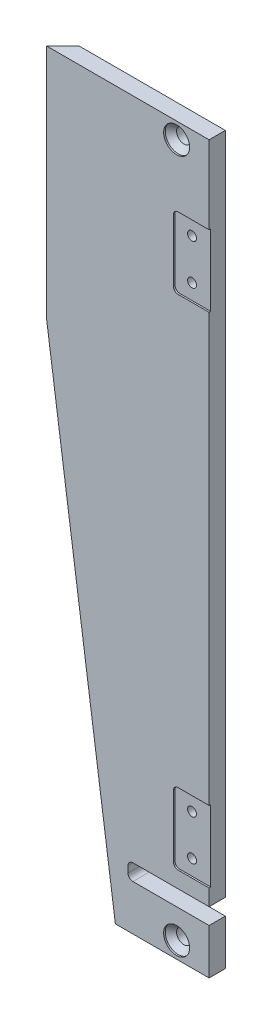
ISO-10303-21;
HEADER;
FILE_DESCRIPTION(('STEP AP214'),'2;1');
FILE_NAME('part.step','',(''),(''),'','','');
FILE_SCHEMA(('AUTOMOTIVE_DESIGN { 1 0 10303 214 1 1 1 1 }'));
ENDSEC;
DATA;
#1=APPLICATION_CONTEXT('core data for automotive mechanical design processes');
#2=APPLICATION_PROTOCOL_DEFINITION('international standard','automotive_design',2000,#1);
#3=PRODUCT_CONTEXT('',#1,'mechanical');
#4=PRODUCT('Part','Part','',(#3));
#5=PRODUCT_RELATED_PRODUCT_CATEGORY('part','',(#4));
#6=PRODUCT_DEFINITION_FORMATION('','',#4);
#7=PRODUCT_DEFINITION_CONTEXT('part definition',#1,'design');
#8=PRODUCT_DEFINITION('design','',#6,#7);
#9=PRODUCT_DEFINITION_SHAPE('','',#8);
#10=(LENGTH_UNIT() NAMED_UNIT(*) SI_UNIT(.MILLI.,.METRE.));
#11=(NAMED_UNIT(*) PLANE_ANGLE_UNIT() SI_UNIT($,.RADIAN.));
#12=(NAMED_UNIT(*) SI_UNIT($,.STERADIAN.) SOLID_ANGLE_UNIT());
#13=UNCERTAINTY_MEASURE_WITH_UNIT(LENGTH_MEASURE(1.E-05),#10,'distance_accuracy_value','');
#14=(GEOMETRIC_REPRESENTATION_CONTEXT(3) GLOBAL_UNCERTAINTY_ASSIGNED_CONTEXT((#13)) GLOBAL_UNIT_ASSIGNED_CONTEXT((#10,
#11,#12)) REPRESENTATION_CONTEXT('',''));
#15=CARTESIAN_POINT('',(0.,0.,0.));
#16=DIRECTION('',(0.,0.,1.));
#17=DIRECTION('',(1.,0.,0.));
#18=AXIS2_PLACEMENT_3D('',#15,#16,#17);
#19=CARTESIAN_POINT('',(0.,-447.,10.));
#20=DIRECTION('',(-1.,0.,0.));
#21=DIRECTION('',(0.,0.,1.));
#22=AXIS2_PLACEMENT_3D('',#19,#20,#21);
#23=PLANE('',#22);
#24=DIRECTION('',(0.,1.,0.));
#25=VECTOR('',#24,1.);
#26=CARTESIAN_POINT('',(0.,-447.,0.));
#27=LINE('',#26,#25);
#28=CARTESIAN_POINT('',(0.,-447.,0.));
#29=VERTEX_POINT('',#28);
#30=CARTESIAN_POINT('',(0.,-419.,0.));
#31=VERTEX_POINT('',#30);
#32=EDGE_CURVE('E331',#29,#31,#27,.T.);
#33=ORIENTED_EDGE('',*,*,#32,.T.);
#34=DIRECTION('',(0.,0.,1.));
#35=VECTOR('',#34,1.);
#36=CARTESIAN_POINT('',(0.,-419.,-20.));
#37=LINE('',#36,#35);
#38=CARTESIAN_POINT('',(0.,-419.,10.));
#39=VERTEX_POINT('',#38);
#40=EDGE_CURVE('E279',#31,#39,#37,.T.);
#41=ORIENTED_EDGE('',*,*,#40,.T.);
#42=DIRECTION('',(0.,1.,0.));
#43=VECTOR('',#42,1.);
#44=CARTESIAN_POINT('',(0.,-447.,10.));
#45=LINE('',#44,#43);
#46=CARTESIAN_POINT('',(0.,-447.,10.));
#47=VERTEX_POINT('',#46);
#48=EDGE_CURVE('E316',#47,#39,#45,.T.);
#49=ORIENTED_EDGE('',*,*,#48,.F.);
#50=DIRECTION('',(0.,0.,-1.));
#51=VECTOR('',#50,1.);
#52=CARTESIAN_POINT('',(0.,-447.,10.));
#53=LINE('',#52,#51);
#54=EDGE_CURVE('E330',#47,#29,#53,.T.);
#55=ORIENTED_EDGE('',*,*,#54,.T.);
#56=EDGE_LOOP('',(#33,#41,#49,#55));
#57=FACE_BOUND('',#56,.T.);
#58=ADVANCED_FACE('F32',(#57),#23,.F.);
#59=DIRECTION('',(0.,1.,0.));
#60=VECTOR('',#59,1.);
#61=CARTESIAN_POINT('',(0.,-48.0000000000009,9.));
#62=LINE('',#61,#60);
#63=CARTESIAN_POINT('',(0.,-92.0000000000009,9.));
#64=VERTEX_POINT('',#63);
#65=CARTESIAN_POINT('',(0.,-48.0000000000009,9.));
#66=VERTEX_POINT('',#65);
#67=EDGE_CURVE('E195',#64,#66,#62,.T.);
#68=ORIENTED_EDGE('',*,*,#67,.F.);
#69=DIRECTION('',(0.,0.,1.));
#70=VECTOR('',#69,1.);
#71=CARTESIAN_POINT('',(0.,-92.0000000000009,9.));
#72=LINE('',#71,#70);
#73=CARTESIAN_POINT('',(0.,-92.0000000000009,10.));
#74=VERTEX_POINT('',#73);
#75=EDGE_CURVE('E267',#64,#74,#72,.T.);
#76=ORIENTED_EDGE('',*,*,#75,.T.);
#77=CARTESIAN_POINT('',(0.,-355.000000000001,10.));
#78=VERTEX_POINT('',#77);
#79=EDGE_CURVE('E414',#78,#74,#45,.T.);
#80=ORIENTED_EDGE('',*,*,#79,.F.);
#81=DIRECTION('',(0.,0.,1.));
#82=VECTOR('',#81,1.);
#83=CARTESIAN_POINT('',(0.,-355.000000000001,9.));
#84=LINE('',#83,#82);
#85=CARTESIAN_POINT('',(0.,-355.000000000001,9.));
#86=VERTEX_POINT('',#85);
#87=EDGE_CURVE('E55',#86,#78,#84,.T.);
#88=ORIENTED_EDGE('',*,*,#87,.F.);
#89=DIRECTION('',(0.,1.,0.));
#90=VECTOR('',#89,1.);
#91=CARTESIAN_POINT('',(0.,-355.000000000001,9.));
#92=LINE('',#91,#90);
#93=CARTESIAN_POINT('',(0.,-399.000000000001,9.));
#94=VERTEX_POINT('',#93);
#95=EDGE_CURVE('E218',#94,#86,#92,.T.);
#96=ORIENTED_EDGE('',*,*,#95,.F.);
#97=DIRECTION('',(0.,0.,1.));
#98=VECTOR('',#97,1.);
#99=CARTESIAN_POINT('',(0.,-399.000000000001,9.));
#100=LINE('',#99,#98);
#101=CARTESIAN_POINT('',(0.,-399.000000000001,10.));
#102=VERTEX_POINT('',#101);
#103=EDGE_CURVE('E250',#94,#102,#100,.T.);
#104=ORIENTED_EDGE('',*,*,#103,.T.);
#105=CARTESIAN_POINT('',(0.,-409.,10.));
#106=VERTEX_POINT('',#105);
#107=EDGE_CURVE('E320',#106,#102,#45,.T.);
#108=ORIENTED_EDGE('',*,*,#107,.F.);
#109=DIRECTION('',(0.,0.,1.));
#110=VECTOR('',#109,1.);
#111=CARTESIAN_POINT('',(0.,-409.,-20.));
#112=LINE('',#111,#110);
#113=CARTESIAN_POINT('',(0.,-409.,0.));
#114=VERTEX_POINT('',#113);
#115=EDGE_CURVE('E278',#114,#106,#112,.T.);
#116=ORIENTED_EDGE('',*,*,#115,.F.);
#117=CARTESIAN_POINT('',(0.,0.,0.));
#118=VERTEX_POINT('',#117);
#119=EDGE_CURVE('E335',#114,#118,#27,.T.);
#120=ORIENTED_EDGE('',*,*,#119,.T.);
#121=DIRECTION('',(0.,0.,-1.));
#122=VECTOR('',#121,1.);
#123=CARTESIAN_POINT('',(0.,0.,10.));
#124=LINE('',#123,#122);
#125=CARTESIAN_POINT('',(0.,0.,10.));
#126=VERTEX_POINT('',#125);
#127=EDGE_CURVE('E342',#126,#118,#124,.T.);
#128=ORIENTED_EDGE('',*,*,#127,.F.);
#129=CARTESIAN_POINT('',(0.,-48.0000000000009,10.));
#130=VERTEX_POINT('',#129);
#131=EDGE_CURVE('E210',#130,#126,#45,.T.);
#132=ORIENTED_EDGE('',*,*,#131,.F.);
#133=DIRECTION('',(0.,0.,1.));
#134=VECTOR('',#133,1.);
#135=CARTESIAN_POINT('',(0.,-48.0000000000009,9.));
#136=LINE('',#135,#134);
#137=EDGE_CURVE('E47',#66,#130,#136,.T.);
#138=ORIENTED_EDGE('',*,*,#137,.F.);
#139=EDGE_LOOP('',(#68,#76,#80,#88,#96,#104,#108,#116,#120,#128,#132,#138));
#140=FACE_BOUND('',#139,.T.);
#141=ADVANCED_FACE('F208',(#140),#23,.F.);
#142=CARTESIAN_POINT('',(0.,0.,10.));
#143=DIRECTION('',(0.,-1.,0.));
#144=DIRECTION('',(0.,0.,-1.));
#145=AXIS2_PLACEMENT_3D('',#142,#143,#144);
#146=PLANE('',#145);
#147=DIRECTION('',(-1.,0.,0.));
#148=VECTOR('',#147,1.);
#149=CARTESIAN_POINT('',(0.,0.,0.));
#150=LINE('',#149,#148);
#151=CARTESIAN_POINT('',(-89.9999999999999,0.,0.));
#152=VERTEX_POINT('',#151);
#153=EDGE_CURVE('E334',#118,#152,#150,.T.);
#154=ORIENTED_EDGE('',*,*,#153,.T.);
#155=DIRECTION('',(0.707106781186549,0.,-0.707106781186546));
#156=VECTOR('',#155,1.);
#157=CARTESIAN_POINT('',(-100.,0.,10.));
#158=LINE('',#157,#156);
#159=CARTESIAN_POINT('',(-100.,0.,10.));
#160=VERTEX_POINT('',#159);
#161=EDGE_CURVE('E351',#152,#160,#158,.F.);
#162=ORIENTED_EDGE('',*,*,#161,.T.);
#163=DIRECTION('',(-1.,0.,0.));
#164=VECTOR('',#163,1.);
#165=CARTESIAN_POINT('',(0.,0.,10.));
#166=LINE('',#165,#164);
#167=EDGE_CURVE('E319',#126,#160,#166,.T.);
#168=ORIENTED_EDGE('',*,*,#167,.F.);
#169=ORIENTED_EDGE('',*,*,#127,.T.);
#170=EDGE_LOOP('',(#154,#162,#168,#169));
#171=FACE_BOUND('',#170,.T.);
#172=ADVANCED_FACE('F401',(#171),#146,.F.);
#173=CARTESIAN_POINT('',(-57.69720875458,-447.,10.));
#174=DIRECTION('',(0.,1.,0.));
#175=DIRECTION('',(-1.,0.,0.));
#176=AXIS2_PLACEMENT_3D('',#173,#174,#175);
#177=PLANE('',#176);
#178=DIRECTION('',(1.,0.,0.));
#179=VECTOR('',#178,1.);
#180=CARTESIAN_POINT('',(-57.69720875458,-447.,10.));
#181=LINE('',#180,#179);
#182=CARTESIAN_POINT('',(-57.69720875458,-447.,10.));
#183=VERTEX_POINT('',#182);
#184=EDGE_CURVE('E328',#183,#47,#181,.T.);
#185=ORIENTED_EDGE('',*,*,#184,.F.);
#186=DIRECTION('',(-0.710555868400576,0.,0.703640787534025));
#187=VECTOR('',#186,1.);
#188=CARTESIAN_POINT('',(-79.0554498870937,-447.,31.1503841980111));
#189=LINE('',#188,#187);
#190=CARTESIAN_POINT('',(-47.5989330293938,-447.,0.));
#191=VERTEX_POINT('',#190);
#192=EDGE_CURVE('E345',#183,#191,#189,.F.);
#193=ORIENTED_EDGE('',*,*,#192,.T.);
#194=DIRECTION('',(1.,0.,0.));
#195=VECTOR('',#194,1.);
#196=CARTESIAN_POINT('',(-57.69720875458,-447.,0.));
#197=LINE('',#196,#195);
#198=EDGE_CURVE('E338',#191,#29,#197,.T.);
#199=ORIENTED_EDGE('',*,*,#198,.T.);
#200=ORIENTED_EDGE('',*,*,#54,.F.);
#201=EDGE_LOOP('',(#185,#193,#199,#200));
#202=FACE_BOUND('',#201,.T.);
#203=ADVANCED_FACE('F519',(#202),#177,.F.);
#204=CARTESIAN_POINT('',(0.,0.,10.));
#205=DIRECTION('',(0.,0.,1.));
#206=DIRECTION('',(1.,0.,0.));
#207=AXIS2_PLACEMENT_3D('',#204,#205,#206);
#208=PLANE('',#207);
#209=DIRECTION('',(1.,0.,0.));
#210=VECTOR('',#209,1.);
#211=CARTESIAN_POINT('',(-18.9999999999995,-92.0000000000009,10.));
#212=LINE('',#211,#210);
#213=CARTESIAN_POINT('',(-18.9999999999995,-92.0000000000009,10.));
#214=VERTEX_POINT('',#213);
#215=EDGE_CURVE('E205',#214,#74,#212,.T.);
#216=ORIENTED_EDGE('',*,*,#215,.F.);
#217=CARTESIAN_POINT('',(-18.9999999999995,-89.0000000000009,10.));
#218=DIRECTION('',(0.,0.,1.));
#219=DIRECTION('',(1.,0.,0.));
#220=AXIS2_PLACEMENT_3D('',#217,#218,#219);
#221=CIRCLE('',#220,3.);
#222=CARTESIAN_POINT('',(-21.9999999999995,-89.0000000000009,10.));
#223=VERTEX_POINT('',#222);
#224=EDGE_CURVE('E428',#223,#214,#221,.T.);
#225=ORIENTED_EDGE('',*,*,#224,.F.);
#226=DIRECTION('',(0.,-1.,0.));
#227=VECTOR('',#226,1.);
#228=CARTESIAN_POINT('',(-21.9999999999995,-51.0000000000009,10.));
#229=LINE('',#228,#227);
#230=CARTESIAN_POINT('',(-21.9999999999995,-51.0000000000009,10.));
#231=VERTEX_POINT('',#230);
#232=EDGE_CURVE('E422',#231,#223,#229,.T.);
#233=ORIENTED_EDGE('',*,*,#232,.F.);
#234=CARTESIAN_POINT('',(-18.9999999999995,-51.0000000000009,10.));
#235=DIRECTION('',(0.,0.,1.));
#236=DIRECTION('',(1.,0.,0.));
#237=AXIS2_PLACEMENT_3D('',#234,#235,#236);
#238=CIRCLE('',#237,3.);
#239=CARTESIAN_POINT('',(-18.9999999999995,-48.0000000000009,10.));
#240=VERTEX_POINT('',#239);
#241=EDGE_CURVE('E420',#240,#231,#238,.T.);
#242=ORIENTED_EDGE('',*,*,#241,.F.);
#243=DIRECTION('',(-1.,0.,0.));
#244=VECTOR('',#243,1.);
#245=CARTESIAN_POINT('',(-18.9999999999995,-48.0000000000009,10.));
#246=LINE('',#245,#244);
#247=EDGE_CURVE('E253',#130,#240,#246,.T.);
#248=ORIENTED_EDGE('',*,*,#247,.F.);
#249=ORIENTED_EDGE('',*,*,#131,.T.);
#250=ORIENTED_EDGE('',*,*,#167,.T.);
#251=DIRECTION('',(0.,-1.,0.));
#252=VECTOR('',#251,1.);
#253=CARTESIAN_POINT('',(-100.,0.,10.));
#254=LINE('',#253,#252);
#255=CARTESIAN_POINT('',(-100.,-146.,10.));
#256=VERTEX_POINT('',#255);
#257=EDGE_CURVE('E323',#160,#256,#254,.T.);
#258=ORIENTED_EDGE('',*,*,#257,.T.);
#259=DIRECTION('',(0.139173100960066,-0.99026806874157,0.));
#260=VECTOR('',#259,1.);
#261=CARTESIAN_POINT('',(-100.,-146.,10.));
#262=LINE('',#261,#260);
#263=EDGE_CURVE('E325',#256,#183,#262,.T.);
#264=ORIENTED_EDGE('',*,*,#263,.T.);
#265=ORIENTED_EDGE('',*,*,#184,.T.);
#266=ORIENTED_EDGE('',*,*,#48,.T.);
#267=DIRECTION('',(1.,0.,0.));
#268=VECTOR('',#267,1.);
#269=CARTESIAN_POINT('',(0.,-419.,10.));
#270=LINE('',#269,#268);
#271=CARTESIAN_POINT('',(-46.8972087545804,-419.,10.));
#272=VERTEX_POINT('',#271);
#273=EDGE_CURVE('E276',#272,#39,#270,.T.);
#274=ORIENTED_EDGE('',*,*,#273,.F.);
#275=CARTESIAN_POINT('',(-46.8972087545804,-416.,10.));
#276=DIRECTION('',(0.,0.,1.));
#277=DIRECTION('',(-1.,0.,0.));
#278=AXIS2_PLACEMENT_3D('',#275,#276,#277);
#279=CIRCLE('',#278,3.);
#280=CARTESIAN_POINT('',(-49.8972087545804,-416.,10.));
#281=VERTEX_POINT('',#280);
#282=EDGE_CURVE('E273',#281,#272,#279,.T.);
#283=ORIENTED_EDGE('',*,*,#282,.F.);
#284=DIRECTION('',(0.,-1.,0.));
#285=VECTOR('',#284,1.);
#286=CARTESIAN_POINT('',(-49.8972087545804,-412.,10.));
#287=LINE('',#286,#285);
#288=CARTESIAN_POINT('',(-49.8972087545804,-412.,10.));
#289=VERTEX_POINT('',#288);
#290=EDGE_CURVE('E270',#289,#281,#287,.T.);
#291=ORIENTED_EDGE('',*,*,#290,.F.);
#292=CARTESIAN_POINT('',(-46.8972087545804,-412.,10.));
#293=DIRECTION('',(0.,0.,1.));
#294=DIRECTION('',(1.,0.,0.));
#295=AXIS2_PLACEMENT_3D('',#292,#293,#294);
#296=CIRCLE('',#295,3.);
#297=CARTESIAN_POINT('',(-46.8972087545804,-409.,10.));
#298=VERTEX_POINT('',#297);
#299=EDGE_CURVE('E266',#298,#289,#296,.T.);
#300=ORIENTED_EDGE('',*,*,#299,.F.);
#301=DIRECTION('',(-1.,0.,0.));
#302=VECTOR('',#301,1.);
#303=CARTESIAN_POINT('',(0.,-409.,10.));
#304=LINE('',#303,#302);
#305=EDGE_CURVE('E263',#106,#298,#304,.T.);
#306=ORIENTED_EDGE('',*,*,#305,.F.);
#307=ORIENTED_EDGE('',*,*,#107,.T.);
#308=DIRECTION('',(1.,0.,0.));
#309=VECTOR('',#308,1.);
#310=CARTESIAN_POINT('',(-18.999999999999,-399.000000000001,10.));
#311=LINE('',#310,#309);
#312=CARTESIAN_POINT('',(-18.999999999999,-399.000000000001,10.));
#313=VERTEX_POINT('',#312);
#314=EDGE_CURVE('E222',#313,#102,#311,.T.);
#315=ORIENTED_EDGE('',*,*,#314,.F.);
#316=CARTESIAN_POINT('',(-18.999999999999,-396.000000000001,10.));
#317=DIRECTION('',(0.,0.,1.));
#318=DIRECTION('',(1.,0.,0.));
#319=AXIS2_PLACEMENT_3D('',#316,#317,#318);
#320=CIRCLE('',#319,3.);
#321=CARTESIAN_POINT('',(-21.999999999999,-396.000000000001,10.));
#322=VERTEX_POINT('',#321);
#323=EDGE_CURVE('E246',#322,#313,#320,.T.);
#324=ORIENTED_EDGE('',*,*,#323,.F.);
#325=DIRECTION('',(0.,-1.,0.));
#326=VECTOR('',#325,1.);
#327=CARTESIAN_POINT('',(-21.9999999999995,-358.000000000001,10.));
#328=LINE('',#327,#326);
#329=CARTESIAN_POINT('',(-21.9999999999995,-358.000000000001,10.));
#330=VERTEX_POINT('',#329);
#331=EDGE_CURVE('E243',#330,#322,#328,.T.);
#332=ORIENTED_EDGE('',*,*,#331,.F.);
#333=CARTESIAN_POINT('',(-18.9999999999995,-358.000000000001,10.));
#334=DIRECTION('',(0.,0.,1.));
#335=DIRECTION('',(1.,0.,0.));
#336=AXIS2_PLACEMENT_3D('',#333,#334,#335);
#337=CIRCLE('',#336,3.);
#338=CARTESIAN_POINT('',(-18.9999999999995,-355.000000000001,10.));
#339=VERTEX_POINT('',#338);
#340=EDGE_CURVE('E239',#339,#330,#337,.T.);
#341=ORIENTED_EDGE('',*,*,#340,.F.);
#342=DIRECTION('',(-1.,0.,0.));
#343=VECTOR('',#342,1.);
#344=CARTESIAN_POINT('',(-18.9999999999995,-355.000000000001,10.));
#345=LINE('',#344,#343);
#346=EDGE_CURVE('E237',#78,#339,#345,.T.);
#347=ORIENTED_EDGE('',*,*,#346,.F.);
#348=ORIENTED_EDGE('',*,*,#79,.T.);
#349=EDGE_LOOP('',(#216,#225,#233,#242,#248,#249,#250,#258,#264,#265,#266,#274,#283,#291,#300,
#306,#307,#315,#324,#332,#341,#347,#348));
#350=FACE_BOUND('',#349,.T.);
#351=CARTESIAN_POINT('',(-20.0000000000004,-10.,10.));
#352=DIRECTION('',(0.,0.,1.));
#353=DIRECTION('',(1.,0.,0.));
#354=AXIS2_PLACEMENT_3D('',#351,#352,#353);
#355=CIRCLE('',#354,8.);
#356=CARTESIAN_POINT('',(-12.0000000000004,-10.,10.));
#357=VERTEX_POINT('',#356);
#358=EDGE_CURVE('E282',#357,#357,#355,.T.);
#359=ORIENTED_EDGE('',*,*,#358,.F.);
#360=EDGE_LOOP('',(#359));
#361=FACE_BOUND('',#360,.T.);
#362=CARTESIAN_POINT('',(-19.9999999999972,-437.,10.));
#363=DIRECTION('',(0.,0.,1.));
#364=DIRECTION('',(1.,0.,0.));
#365=AXIS2_PLACEMENT_3D('',#362,#363,#364);
#366=CIRCLE('',#365,8.);
#367=CARTESIAN_POINT('',(-11.9999999999972,-437.,10.));
#368=VERTEX_POINT('',#367);
#369=EDGE_CURVE('E303',#368,#368,#366,.T.);
#370=ORIENTED_EDGE('',*,*,#369,.F.);
#371=EDGE_LOOP('',(#370));
#372=FACE_BOUND('',#371,.T.);
#373=ADVANCED_FACE('F380',(#350,#361,#372),#208,.T.);
#374=CARTESIAN_POINT('',(0.,0.,0.));
#375=DIRECTION('',(0.,0.,1.));
#376=DIRECTION('',(1.,0.,0.));
#377=AXIS2_PLACEMENT_3D('',#374,#375,#376);
#378=PLANE('',#377);
#379=CARTESIAN_POINT('',(-11.4999999999995,-57.5000000000009,0.));
#380=DIRECTION('',(0.,0.,1.));
#381=DIRECTION('',(1.,0.,0.));
#382=AXIS2_PLACEMENT_3D('',#379,#380,#381);
#383=CIRCLE('',#382,2.75);
#384=CARTESIAN_POINT('',(-8.74999999999954,-57.5000000000009,0.));
#385=VERTEX_POINT('',#384);
#386=EDGE_CURVE('E240',#385,#385,#383,.T.);
#387=ORIENTED_EDGE('',*,*,#386,.T.);
#388=EDGE_LOOP('',(#387));
#389=FACE_BOUND('',#388,.T.);
#390=CARTESIAN_POINT('',(-11.4999999999995,-82.5000000000009,0.));
#391=DIRECTION('',(0.,0.,1.));
#392=DIRECTION('',(1.,0.,0.));
#393=AXIS2_PLACEMENT_3D('',#390,#391,#392);
#394=CIRCLE('',#393,2.75);
#395=CARTESIAN_POINT('',(-8.74999999999954,-82.5000000000009,0.));
#396=VERTEX_POINT('',#395);
#397=EDGE_CURVE('E465',#396,#396,#394,.T.);
#398=ORIENTED_EDGE('',*,*,#397,.T.);
#399=EDGE_LOOP('',(#398));
#400=FACE_BOUND('',#399,.T.);
#401=CARTESIAN_POINT('',(-11.499999999999,-364.500000000001,0.));
#402=DIRECTION('',(0.,0.,1.));
#403=DIRECTION('',(1.,0.,0.));
#404=AXIS2_PLACEMENT_3D('',#401,#402,#403);
#405=CIRCLE('',#404,2.75);
#406=CARTESIAN_POINT('',(-8.74999999999895,-364.500000000001,0.));
#407=VERTEX_POINT('',#406);
#408=EDGE_CURVE('E459',#407,#407,#405,.T.);
#409=ORIENTED_EDGE('',*,*,#408,.T.);
#410=EDGE_LOOP('',(#409));
#411=FACE_BOUND('',#410,.T.);
#412=CARTESIAN_POINT('',(-11.499999999999,-389.500000000001,0.));
#413=DIRECTION('',(0.,0.,1.));
#414=DIRECTION('',(1.,0.,0.));
#415=AXIS2_PLACEMENT_3D('',#412,#413,#414);
#416=CIRCLE('',#415,2.75);
#417=CARTESIAN_POINT('',(-8.74999999999895,-389.500000000001,0.));
#418=VERTEX_POINT('',#417);
#419=EDGE_CURVE('E453',#418,#418,#416,.T.);
#420=ORIENTED_EDGE('',*,*,#419,.T.);
#421=EDGE_LOOP('',(#420));
#422=FACE_BOUND('',#421,.T.);
#423=CARTESIAN_POINT('',(-20.0000000000004,-10.,0.));
#424=DIRECTION('',(0.,0.,1.));
#425=DIRECTION('',(1.,0.,0.));
#426=AXIS2_PLACEMENT_3D('',#423,#424,#425);
#427=CIRCLE('',#426,4.50000000000001);
#428=CARTESIAN_POINT('',(-15.5000000000004,-10.,0.));
#429=VERTEX_POINT('',#428);
#430=EDGE_CURVE('E300',#429,#429,#427,.T.);
#431=ORIENTED_EDGE('',*,*,#430,.T.);
#432=EDGE_LOOP('',(#431));
#433=FACE_BOUND('',#432,.T.);
#434=CARTESIAN_POINT('',(-19.9999999999972,-437.,0.));
#435=DIRECTION('',(0.,0.,1.));
#436=DIRECTION('',(1.,0.,0.));
#437=AXIS2_PLACEMENT_3D('',#434,#435,#436);
#438=CIRCLE('',#437,4.50000000000001);
#439=CARTESIAN_POINT('',(-15.4999999999972,-437.,0.));
#440=VERTEX_POINT('',#439);
#441=EDGE_CURVE('E312',#440,#440,#438,.T.);
#442=ORIENTED_EDGE('',*,*,#441,.T.);
#443=EDGE_LOOP('',(#442));
#444=FACE_BOUND('',#443,.T.);
#445=CARTESIAN_POINT('',(-46.8972087545804,-416.,0.));
#446=DIRECTION('',(0.,0.,1.));
#447=DIRECTION('',(1.,0.,0.));
#448=AXIS2_PLACEMENT_3D('',#445,#446,#447);
#449=CIRCLE('',#448,3.);
#450=CARTESIAN_POINT('',(-49.8972087545804,-416.,0.));
#451=VERTEX_POINT('',#450);
#452=CARTESIAN_POINT('',(-46.8972087545804,-419.,0.));
#453=VERTEX_POINT('',#452);
#454=EDGE_CURVE('E40',#451,#453,#449,.T.);
#455=ORIENTED_EDGE('',*,*,#454,.T.);
#456=DIRECTION('',(1.,0.,0.));
#457=VECTOR('',#456,1.);
#458=CARTESIAN_POINT('',(0.,-419.,0.));
#459=LINE('',#458,#457);
#460=EDGE_CURVE('E11',#453,#31,#459,.T.);
#461=ORIENTED_EDGE('',*,*,#460,.T.);
#462=ORIENTED_EDGE('',*,*,#32,.F.);
#463=ORIENTED_EDGE('',*,*,#198,.F.);
#464=DIRECTION('',(-0.139173100960066,0.99026806874157,0.));
#465=VECTOR('',#464,1.);
#466=CARTESIAN_POINT('',(-108.281931084141,-15.2180329777521,0.));
#467=LINE('',#466,#465);
#468=CARTESIAN_POINT('',(-89.9999999999999,-145.300731880565,0.));
#469=VERTEX_POINT('',#468);
#470=EDGE_CURVE('E349',#191,#469,#467,.T.);
#471=ORIENTED_EDGE('',*,*,#470,.T.);
#472=DIRECTION('',(0.,1.,0.));
#473=VECTOR('',#472,1.);
#474=CARTESIAN_POINT('',(-89.9999999999999,0.,0.));
#475=LINE('',#474,#473);
#476=EDGE_CURVE('E347',#469,#152,#475,.T.);
#477=ORIENTED_EDGE('',*,*,#476,.T.);
#478=ORIENTED_EDGE('',*,*,#153,.F.);
#479=ORIENTED_EDGE('',*,*,#119,.F.);
#480=DIRECTION('',(-1.,0.,0.));
#481=VECTOR('',#480,1.);
#482=CARTESIAN_POINT('',(0.,-409.,0.));
#483=LINE('',#482,#481);
#484=CARTESIAN_POINT('',(-46.8972087545804,-409.,0.));
#485=VERTEX_POINT('',#484);
#486=EDGE_CURVE('E353',#114,#485,#483,.T.);
#487=ORIENTED_EDGE('',*,*,#486,.T.);
#488=CARTESIAN_POINT('',(-46.8972087545804,-412.,0.));
#489=DIRECTION('',(0.,0.,1.));
#490=DIRECTION('',(1.,0.,0.));
#491=AXIS2_PLACEMENT_3D('',#488,#489,#490);
#492=CIRCLE('',#491,3.);
#493=CARTESIAN_POINT('',(-49.8972087545804,-412.,0.));
#494=VERTEX_POINT('',#493);
#495=EDGE_CURVE('E358',#485,#494,#492,.T.);
#496=ORIENTED_EDGE('',*,*,#495,.T.);
#497=DIRECTION('',(0.,-1.,0.));
#498=VECTOR('',#497,1.);
#499=CARTESIAN_POINT('',(-49.8972087545804,0.,0.));
#500=LINE('',#499,#498);
#501=EDGE_CURVE('E361',#494,#451,#500,.T.);
#502=ORIENTED_EDGE('',*,*,#501,.T.);
#503=EDGE_LOOP('',(#455,#461,#462,#463,#471,#477,#478,#479,#487,#496,#502));
#504=FACE_BOUND('',#503,.T.);
#505=ADVANCED_FACE('F365',(#389,#400,#411,#422,#433,#444,#504),#378,.F.);
#506=CARTESIAN_POINT('',(-100.,0.,10.));
#507=DIRECTION('',(0.707106781186545,0.,0.707106781186549));
#508=DIRECTION('',(0.,-1.,0.));
#509=AXIS2_PLACEMENT_3D('',#506,#507,#508);
#510=PLANE('',#509);
#511=ORIENTED_EDGE('',*,*,#161,.F.);
#512=ORIENTED_EDGE('',*,*,#476,.F.);
#513=DIRECTION('',(-0.706243967529311,-0.0493853891036542,0.706243967529308));
#514=VECTOR('',#513,1.);
#515=CARTESIAN_POINT('',(-94.9077925617726,-145.64391816809,4.90779256177268));
#516=LINE('',#515,#514);
#517=EDGE_CURVE('E315',#256,#469,#516,.F.);
#518=ORIENTED_EDGE('',*,*,#517,.F.);
#519=ORIENTED_EDGE('',*,*,#257,.F.);
#520=EDGE_LOOP('',(#511,#512,#518,#519));
#521=FACE_BOUND('',#520,.T.);
#522=ADVANCED_FACE('F34',(#521),#510,.F.);
#523=CARTESIAN_POINT('',(-100.,-146.,10.));
#524=DIRECTION('',(0.700225266599669,0.0984102434476225,0.707106781186549));
#525=DIRECTION('',(0.139173100960066,-0.99026806874157,0.));
#526=AXIS2_PLACEMENT_3D('',#523,#524,#525);
#527=PLANE('',#526);
#528=ORIENTED_EDGE('',*,*,#517,.T.);
#529=ORIENTED_EDGE('',*,*,#470,.F.);
#530=ORIENTED_EDGE('',*,*,#192,.F.);
#531=ORIENTED_EDGE('',*,*,#263,.F.);
#532=EDGE_LOOP('',(#528,#529,#530,#531));
#533=FACE_BOUND('',#532,.T.);
#534=ADVANCED_FACE('F392',(#533),#527,.F.);
#535=CARTESIAN_POINT('',(-19.9999999999972,-437.,10.));
#536=DIRECTION('',(0.,0.,1.));
#537=DIRECTION('',(1.,0.,0.));
#538=AXIS2_PLACEMENT_3D('',#535,#536,#537);
#539=CYLINDRICAL_SURFACE('',#538,4.50000000000001);
#540=ORIENTED_EDGE('',*,*,#441,.F.);
#541=EDGE_LOOP('',(#540));
#542=FACE_BOUND('',#541,.T.);
#543=CARTESIAN_POINT('',(-19.9999999999972,-437.,5.5));
#544=DIRECTION('',(0.,0.,1.));
#545=DIRECTION('',(1.,0.,0.));
#546=AXIS2_PLACEMENT_3D('',#543,#544,#545);
#547=CIRCLE('',#546,4.5);
#548=CARTESIAN_POINT('',(-15.4999999999972,-437.,5.5));
#549=VERTEX_POINT('',#548);
#550=EDGE_CURVE('E309',#549,#549,#547,.T.);
#551=ORIENTED_EDGE('',*,*,#550,.T.);
#552=EDGE_LOOP('',(#551));
#553=FACE_BOUND('',#552,.T.);
#554=ADVANCED_FACE('F504',(#542,#553),#539,.F.);
#555=CARTESIAN_POINT('',(-19.9999999999972,-437.,9.));
#556=DIRECTION('',(0.,0.,1.));
#557=DIRECTION('',(1.,0.,0.));
#558=AXIS2_PLACEMENT_3D('',#555,#556,#557);
#559=CONICAL_SURFACE('',#558,8.,0.785398163397449);
#560=ORIENTED_EDGE('',*,*,#550,.F.);
#561=EDGE_LOOP('',(#560));
#562=FACE_BOUND('',#561,.T.);
#563=CARTESIAN_POINT('',(-19.9999999999972,-437.,9.));
#564=DIRECTION('',(0.,0.,1.));
#565=DIRECTION('',(1.,0.,0.));
#566=AXIS2_PLACEMENT_3D('',#563,#564,#565);
#567=CIRCLE('',#566,8.);
#568=CARTESIAN_POINT('',(-11.9999999999972,-437.,9.));
#569=VERTEX_POINT('',#568);
#570=EDGE_CURVE('E306',#569,#569,#567,.T.);
#571=ORIENTED_EDGE('',*,*,#570,.T.);
#572=EDGE_LOOP('',(#571));
#573=FACE_BOUND('',#572,.T.);
#574=ADVANCED_FACE('F509',(#562,#573),#559,.F.);
#575=CARTESIAN_POINT('',(-19.9999999999972,-437.,10.));
#576=DIRECTION('',(0.,0.,1.));
#577=DIRECTION('',(1.,0.,0.));
#578=AXIS2_PLACEMENT_3D('',#575,#576,#577);
#579=CYLINDRICAL_SURFACE('',#578,8.);
#580=ORIENTED_EDGE('',*,*,#570,.F.);
#581=EDGE_LOOP('',(#580));
#582=FACE_BOUND('',#581,.T.);
#583=ORIENTED_EDGE('',*,*,#369,.T.);
#584=EDGE_LOOP('',(#583));
#585=FACE_BOUND('',#584,.T.);
#586=ADVANCED_FACE('F711',(#582,#585),#579,.F.);
#587=CARTESIAN_POINT('',(-20.0000000000004,-10.,10.));
#588=DIRECTION('',(0.,0.,1.));
#589=DIRECTION('',(1.,0.,0.));
#590=AXIS2_PLACEMENT_3D('',#587,#588,#589);
#591=CYLINDRICAL_SURFACE('',#590,4.50000000000001);
#592=ORIENTED_EDGE('',*,*,#430,.F.);
#593=EDGE_LOOP('',(#592));
#594=FACE_BOUND('',#593,.T.);
#595=CARTESIAN_POINT('',(-20.0000000000004,-10.,5.5));
#596=DIRECTION('',(0.,0.,1.));
#597=DIRECTION('',(1.,0.,0.));
#598=AXIS2_PLACEMENT_3D('',#595,#596,#597);
#599=CIRCLE('',#598,4.5);
#600=CARTESIAN_POINT('',(-15.5000000000004,-10.,5.5));
#601=VERTEX_POINT('',#600);
#602=EDGE_CURVE('E297',#601,#601,#599,.T.);
#603=ORIENTED_EDGE('',*,*,#602,.T.);
#604=EDGE_LOOP('',(#603));
#605=FACE_BOUND('',#604,.T.);
#606=ADVANCED_FACE('F707',(#594,#605),#591,.F.);
#607=CARTESIAN_POINT('',(-20.0000000000004,-10.,9.));
#608=DIRECTION('',(0.,0.,1.));
#609=DIRECTION('',(1.,0.,0.));
#610=AXIS2_PLACEMENT_3D('',#607,#608,#609);
#611=CONICAL_SURFACE('',#610,8.,0.785398163397449);
#612=ORIENTED_EDGE('',*,*,#602,.F.);
#613=EDGE_LOOP('',(#612));
#614=FACE_BOUND('',#613,.T.);
#615=CARTESIAN_POINT('',(-20.0000000000004,-10.,9.));
#616=DIRECTION('',(0.,0.,1.));
#617=DIRECTION('',(1.,0.,0.));
#618=AXIS2_PLACEMENT_3D('',#615,#616,#617);
#619=CIRCLE('',#618,8.);
#620=CARTESIAN_POINT('',(-12.0000000000004,-10.,9.));
#621=VERTEX_POINT('',#620);
#622=EDGE_CURVE('E294',#621,#621,#619,.T.);
#623=ORIENTED_EDGE('',*,*,#622,.T.);
#624=EDGE_LOOP('',(#623));
#625=FACE_BOUND('',#624,.T.);
#626=ADVANCED_FACE('F703',(#614,#625),#611,.F.);
#627=CARTESIAN_POINT('',(-20.0000000000004,-10.,10.));
#628=DIRECTION('',(0.,0.,1.));
#629=DIRECTION('',(1.,0.,0.));
#630=AXIS2_PLACEMENT_3D('',#627,#628,#629);
#631=CYLINDRICAL_SURFACE('',#630,8.);
#632=ORIENTED_EDGE('',*,*,#622,.F.);
#633=EDGE_LOOP('',(#632));
#634=FACE_BOUND('',#633,.T.);
#635=ORIENTED_EDGE('',*,*,#358,.T.);
#636=EDGE_LOOP('',(#635));
#637=FACE_BOUND('',#636,.T.);
#638=ADVANCED_FACE('F693',(#634,#637),#631,.F.);
#639=CARTESIAN_POINT('',(0.,-419.,-20.));
#640=DIRECTION('',(0.,-1.,0.));
#641=DIRECTION('',(0.,0.,-1.));
#642=AXIS2_PLACEMENT_3D('',#639,#640,#641);
#643=PLANE('',#642);
#644=DIRECTION('',(0.,0.,1.));
#645=VECTOR('',#644,1.);
#646=CARTESIAN_POINT('',(-46.8972087545804,-419.,-20.));
#647=LINE('',#646,#645);
#648=EDGE_CURVE('E283',#453,#272,#647,.T.);
#649=ORIENTED_EDGE('',*,*,#648,.T.);
#650=ORIENTED_EDGE('',*,*,#273,.T.);
#651=ORIENTED_EDGE('',*,*,#40,.F.);
#652=ORIENTED_EDGE('',*,*,#460,.F.);
#653=EDGE_LOOP('',(#649,#650,#651,#652));
#654=FACE_BOUND('',#653,.T.);
#655=ADVANCED_FACE('F384',(#654),#643,.F.);
#656=CARTESIAN_POINT('',(-46.8972087545804,-416.,-20.));
#657=DIRECTION('',(0.,0.,1.));
#658=DIRECTION('',(1.,0.,0.));
#659=AXIS2_PLACEMENT_3D('',#656,#657,#658);
#660=CYLINDRICAL_SURFACE('',#659,3.);
#661=DIRECTION('',(0.,0.,1.));
#662=VECTOR('',#661,1.);
#663=CARTESIAN_POINT('',(-49.8972087545804,-416.,-20.));
#664=LINE('',#663,#662);
#665=EDGE_CURVE('E285',#451,#281,#664,.T.);
#666=ORIENTED_EDGE('',*,*,#665,.T.);
#667=ORIENTED_EDGE('',*,*,#282,.T.);
#668=ORIENTED_EDGE('',*,*,#648,.F.);
#669=ORIENTED_EDGE('',*,*,#454,.F.);
#670=EDGE_LOOP('',(#666,#667,#668,#669));
#671=FACE_BOUND('',#670,.T.);
#672=ADVANCED_FACE('F370',(#671),#660,.F.);
#673=CARTESIAN_POINT('',(-49.8972087545804,-412.,-20.));
#674=DIRECTION('',(-1.,0.,0.));
#675=DIRECTION('',(0.,0.,1.));
#676=AXIS2_PLACEMENT_3D('',#673,#674,#675);
#677=PLANE('',#676);
#678=DIRECTION('',(0.,0.,1.));
#679=VECTOR('',#678,1.);
#680=CARTESIAN_POINT('',(-49.8972087545804,-412.,-20.));
#681=LINE('',#680,#679);
#682=EDGE_CURVE('E287',#494,#289,#681,.T.);
#683=ORIENTED_EDGE('',*,*,#682,.T.);
#684=ORIENTED_EDGE('',*,*,#290,.T.);
#685=ORIENTED_EDGE('',*,*,#665,.F.);
#686=ORIENTED_EDGE('',*,*,#501,.F.);
#687=EDGE_LOOP('',(#683,#684,#685,#686));
#688=FACE_BOUND('',#687,.T.);
#689=ADVANCED_FACE('F372',(#688),#677,.F.);
#690=CARTESIAN_POINT('',(-46.8972087545804,-412.,-20.));
#691=DIRECTION('',(0.,0.,1.));
#692=DIRECTION('',(1.,0.,0.));
#693=AXIS2_PLACEMENT_3D('',#690,#691,#692);
#694=CYLINDRICAL_SURFACE('',#693,3.);
#695=DIRECTION('',(0.,0.,1.));
#696=VECTOR('',#695,1.);
#697=CARTESIAN_POINT('',(-46.8972087545804,-409.,-20.));
#698=LINE('',#697,#696);
#699=EDGE_CURVE('E289',#485,#298,#698,.T.);
#700=ORIENTED_EDGE('',*,*,#699,.T.);
#701=ORIENTED_EDGE('',*,*,#299,.T.);
#702=ORIENTED_EDGE('',*,*,#682,.F.);
#703=ORIENTED_EDGE('',*,*,#495,.F.);
#704=EDGE_LOOP('',(#700,#701,#702,#703));
#705=FACE_BOUND('',#704,.T.);
#706=ADVANCED_FACE('F410',(#705),#694,.F.);
#707=CARTESIAN_POINT('',(0.,-409.,-20.));
#708=DIRECTION('',(0.,1.,0.));
#709=DIRECTION('',(0.,0.,1.));
#710=AXIS2_PLACEMENT_3D('',#707,#708,#709);
#711=PLANE('',#710);
#712=ORIENTED_EDGE('',*,*,#115,.T.);
#713=ORIENTED_EDGE('',*,*,#305,.T.);
#714=ORIENTED_EDGE('',*,*,#699,.F.);
#715=ORIENTED_EDGE('',*,*,#486,.F.);
#716=EDGE_LOOP('',(#712,#713,#714,#715));
#717=FACE_BOUND('',#716,.T.);
#718=ADVANCED_FACE('F407',(#717),#711,.F.);
#719=CARTESIAN_POINT('',(-18.999999999999,-399.000000000001,9.));
#720=DIRECTION('',(0.,-1.,0.));
#721=DIRECTION('',(0.,0.,-1.));
#722=AXIS2_PLACEMENT_3D('',#719,#720,#721);
#723=PLANE('',#722);
#724=ORIENTED_EDGE('',*,*,#314,.T.);
#725=ORIENTED_EDGE('',*,*,#103,.F.);
#726=DIRECTION('',(1.,0.,0.));
#727=VECTOR('',#726,1.);
#728=CARTESIAN_POINT('',(-18.999999999999,-399.000000000001,9.));
#729=LINE('',#728,#727);
#730=CARTESIAN_POINT('',(-18.999999999999,-399.000000000001,9.));
#731=VERTEX_POINT('',#730);
#732=EDGE_CURVE('E234',#731,#94,#729,.T.);
#733=ORIENTED_EDGE('',*,*,#732,.F.);
#734=DIRECTION('',(0.,0.,1.));
#735=VECTOR('',#734,1.);
#736=CARTESIAN_POINT('',(-18.999999999999,-399.000000000001,9.));
#737=LINE('',#736,#735);
#738=EDGE_CURVE('E254',#731,#313,#737,.T.);
#739=ORIENTED_EDGE('',*,*,#738,.T.);
#740=EDGE_LOOP('',(#724,#725,#733,#739));
#741=FACE_BOUND('',#740,.T.);
#742=ADVANCED_FACE('F550',(#741),#723,.F.);
#743=CARTESIAN_POINT('',(-18.999999999999,-396.000000000001,9.));
#744=DIRECTION('',(0.,0.,1.));
#745=DIRECTION('',(1.,0.,0.));
#746=AXIS2_PLACEMENT_3D('',#743,#744,#745);
#747=CYLINDRICAL_SURFACE('',#746,3.);
#748=ORIENTED_EDGE('',*,*,#323,.T.);
#749=ORIENTED_EDGE('',*,*,#738,.F.);
#750=CARTESIAN_POINT('',(-18.999999999999,-396.000000000001,9.));
#751=DIRECTION('',(0.,0.,1.));
#752=DIRECTION('',(1.,0.,0.));
#753=AXIS2_PLACEMENT_3D('',#750,#751,#752);
#754=CIRCLE('',#753,3.);
#755=CARTESIAN_POINT('',(-21.999999999999,-396.000000000001,9.));
#756=VERTEX_POINT('',#755);
#757=EDGE_CURVE('E231',#756,#731,#754,.T.);
#758=ORIENTED_EDGE('',*,*,#757,.F.);
#759=DIRECTION('',(0.,0.,1.));
#760=VECTOR('',#759,1.);
#761=CARTESIAN_POINT('',(-21.999999999999,-396.000000000001,9.));
#762=LINE('',#761,#760);
#763=EDGE_CURVE('E256',#756,#322,#762,.T.);
#764=ORIENTED_EDGE('',*,*,#763,.T.);
#765=EDGE_LOOP('',(#748,#749,#758,#764));
#766=FACE_BOUND('',#765,.T.);
#767=ADVANCED_FACE('F555',(#766),#747,.F.);
#768=CARTESIAN_POINT('',(-21.9999999999995,-358.000000000001,9.));
#769=DIRECTION('',(-1.,0.,0.));
#770=DIRECTION('',(0.,-1.,0.));
#771=AXIS2_PLACEMENT_3D('',#768,#769,#770);
#772=PLANE('',#771);
#773=ORIENTED_EDGE('',*,*,#331,.T.);
#774=ORIENTED_EDGE('',*,*,#763,.F.);
#775=DIRECTION('',(0.,-1.,0.));
#776=VECTOR('',#775,1.);
#777=CARTESIAN_POINT('',(-21.9999999999995,-358.000000000001,9.));
#778=LINE('',#777,#776);
#779=CARTESIAN_POINT('',(-21.9999999999995,-358.000000000001,9.));
#780=VERTEX_POINT('',#779);
#781=EDGE_CURVE('E228',#780,#756,#778,.T.);
#782=ORIENTED_EDGE('',*,*,#781,.F.);
#783=DIRECTION('',(0.,0.,1.));
#784=VECTOR('',#783,1.);
#785=CARTESIAN_POINT('',(-21.9999999999995,-358.000000000001,9.));
#786=LINE('',#785,#784);
#787=EDGE_CURVE('E258',#780,#330,#786,.T.);
#788=ORIENTED_EDGE('',*,*,#787,.T.);
#789=EDGE_LOOP('',(#773,#774,#782,#788));
#790=FACE_BOUND('',#789,.T.);
#791=ADVANCED_FACE('F565',(#790),#772,.F.);
#792=CARTESIAN_POINT('',(-18.9999999999995,-358.000000000001,9.));
#793=DIRECTION('',(0.,0.,1.));
#794=DIRECTION('',(1.,0.,0.));
#795=AXIS2_PLACEMENT_3D('',#792,#793,#794);
#796=CYLINDRICAL_SURFACE('',#795,3.);
#797=ORIENTED_EDGE('',*,*,#340,.T.);
#798=ORIENTED_EDGE('',*,*,#787,.F.);
#799=CARTESIAN_POINT('',(-18.9999999999995,-358.000000000001,9.));
#800=DIRECTION('',(0.,0.,1.));
#801=DIRECTION('',(1.,0.,0.));
#802=AXIS2_PLACEMENT_3D('',#799,#800,#801);
#803=CIRCLE('',#802,3.);
#804=CARTESIAN_POINT('',(-18.9999999999995,-355.000000000001,9.));
#805=VERTEX_POINT('',#804);
#806=EDGE_CURVE('E225',#805,#780,#803,.T.);
#807=ORIENTED_EDGE('',*,*,#806,.F.);
#808=DIRECTION('',(0.,0.,1.));
#809=VECTOR('',#808,1.);
#810=CARTESIAN_POINT('',(-18.9999999999995,-355.000000000001,9.));
#811=LINE('',#810,#809);
#812=EDGE_CURVE('E260',#805,#339,#811,.T.);
#813=ORIENTED_EDGE('',*,*,#812,.T.);
#814=EDGE_LOOP('',(#797,#798,#807,#813));
#815=FACE_BOUND('',#814,.T.);
#816=ADVANCED_FACE('F575',(#815),#796,.F.);
#817=CARTESIAN_POINT('',(-18.9999999999995,-355.000000000001,9.));
#818=DIRECTION('',(0.,1.,0.));
#819=DIRECTION('',(0.,0.,1.));
#820=AXIS2_PLACEMENT_3D('',#817,#818,#819);
#821=PLANE('',#820);
#822=ORIENTED_EDGE('',*,*,#346,.T.);
#823=ORIENTED_EDGE('',*,*,#812,.F.);
#824=DIRECTION('',(-1.,0.,0.));
#825=VECTOR('',#824,1.);
#826=CARTESIAN_POINT('',(-18.9999999999995,-355.000000000001,9.));
#827=LINE('',#826,#825);
#828=EDGE_CURVE('E221',#86,#805,#827,.T.);
#829=ORIENTED_EDGE('',*,*,#828,.F.);
#830=ORIENTED_EDGE('',*,*,#87,.T.);
#831=EDGE_LOOP('',(#822,#823,#829,#830));
#832=FACE_BOUND('',#831,.T.);
#833=ADVANCED_FACE('F585',(#832),#821,.F.);
#834=CARTESIAN_POINT('',(-18.999999999999,-396.000000000001,9.));
#835=DIRECTION('',(0.,0.,1.));
#836=DIRECTION('',(1.,0.,0.));
#837=AXIS2_PLACEMENT_3D('',#834,#835,#836);
#838=PLANE('',#837);
#839=CARTESIAN_POINT('',(-11.499999999999,-364.500000000001,9.));
#840=DIRECTION('',(0.,0.,1.));
#841=DIRECTION('',(1.,0.,0.));
#842=AXIS2_PLACEMENT_3D('',#839,#840,#841);
#843=CIRCLE('',#842,2.75);
#844=CARTESIAN_POINT('',(-8.74999999999895,-364.500000000001,9.));
#845=VERTEX_POINT('',#844);
#846=EDGE_CURVE('E456',#845,#845,#843,.T.);
#847=ORIENTED_EDGE('',*,*,#846,.F.);
#848=EDGE_LOOP('',(#847));
#849=FACE_BOUND('',#848,.T.);
#850=CARTESIAN_POINT('',(-11.499999999999,-389.500000000001,9.));
#851=DIRECTION('',(0.,0.,1.));
#852=DIRECTION('',(1.,0.,0.));
#853=AXIS2_PLACEMENT_3D('',#850,#851,#852);
#854=CIRCLE('',#853,2.75);
#855=CARTESIAN_POINT('',(-8.74999999999895,-389.500000000001,9.));
#856=VERTEX_POINT('',#855);
#857=EDGE_CURVE('E450',#856,#856,#854,.T.);
#858=ORIENTED_EDGE('',*,*,#857,.F.);
#859=EDGE_LOOP('',(#858));
#860=FACE_BOUND('',#859,.T.);
#861=ORIENTED_EDGE('',*,*,#95,.T.);
#862=ORIENTED_EDGE('',*,*,#828,.T.);
#863=ORIENTED_EDGE('',*,*,#806,.T.);
#864=ORIENTED_EDGE('',*,*,#781,.T.);
#865=ORIENTED_EDGE('',*,*,#757,.T.);
#866=ORIENTED_EDGE('',*,*,#732,.T.);
#867=EDGE_LOOP('',(#861,#862,#863,#864,#865,#866));
#868=FACE_BOUND('',#867,.T.);
#869=ADVANCED_FACE('F595',(#849,#860,#868),#838,.T.);
#870=CARTESIAN_POINT('',(-18.9999999999995,-92.0000000000009,9.));
#871=DIRECTION('',(0.,-1.,0.));
#872=DIRECTION('',(1.,0.,0.));
#873=AXIS2_PLACEMENT_3D('',#870,#871,#872);
#874=PLANE('',#873);
#875=ORIENTED_EDGE('',*,*,#215,.T.);
#876=ORIENTED_EDGE('',*,*,#75,.F.);
#877=DIRECTION('',(1.,0.,0.));
#878=VECTOR('',#877,1.);
#879=CARTESIAN_POINT('',(-18.9999999999995,-92.0000000000009,9.));
#880=LINE('',#879,#878);
#881=CARTESIAN_POINT('',(-18.9999999999995,-92.0000000000009,9.));
#882=VERTEX_POINT('',#881);
#883=EDGE_CURVE('E202',#882,#64,#880,.T.);
#884=ORIENTED_EDGE('',*,*,#883,.F.);
#885=DIRECTION('',(0.,0.,1.));
#886=VECTOR('',#885,1.);
#887=CARTESIAN_POINT('',(-18.9999999999995,-92.0000000000009,9.));
#888=LINE('',#887,#886);
#889=EDGE_CURVE('E433',#882,#214,#888,.T.);
#890=ORIENTED_EDGE('',*,*,#889,.T.);
#891=EDGE_LOOP('',(#875,#876,#884,#890));
#892=FACE_BOUND('',#891,.T.);
#893=ADVANCED_FACE('F602',(#892),#874,.F.);
#894=CARTESIAN_POINT('',(-18.9999999999995,-89.0000000000009,9.));
#895=DIRECTION('',(0.,0.,1.));
#896=DIRECTION('',(1.,0.,0.));
#897=AXIS2_PLACEMENT_3D('',#894,#895,#896);
#898=CYLINDRICAL_SURFACE('',#897,3.);
#899=ORIENTED_EDGE('',*,*,#224,.T.);
#900=ORIENTED_EDGE('',*,*,#889,.F.);
#901=CARTESIAN_POINT('',(-18.9999999999995,-89.0000000000009,9.));
#902=DIRECTION('',(0.,0.,1.));
#903=DIRECTION('',(1.,0.,0.));
#904=AXIS2_PLACEMENT_3D('',#901,#902,#903);
#905=CIRCLE('',#904,3.);
#906=CARTESIAN_POINT('',(-21.9999999999995,-89.0000000000009,9.));
#907=VERTEX_POINT('',#906);
#908=EDGE_CURVE('E214',#907,#882,#905,.T.);
#909=ORIENTED_EDGE('',*,*,#908,.F.);
#910=DIRECTION('',(0.,0.,1.));
#911=VECTOR('',#910,1.);
#912=CARTESIAN_POINT('',(-21.9999999999995,-89.0000000000009,9.));
#913=LINE('',#912,#911);
#914=EDGE_CURVE('E435',#907,#223,#913,.T.);
#915=ORIENTED_EDGE('',*,*,#914,.T.);
#916=EDGE_LOOP('',(#899,#900,#909,#915));
#917=FACE_BOUND('',#916,.T.);
#918=ADVANCED_FACE('F445',(#917),#898,.F.);
#919=CARTESIAN_POINT('',(-21.9999999999995,-51.0000000000009,9.));
#920=DIRECTION('',(-1.,0.,0.));
#921=DIRECTION('',(0.,-1.,0.));
#922=AXIS2_PLACEMENT_3D('',#919,#920,#921);
#923=PLANE('',#922);
#924=ORIENTED_EDGE('',*,*,#232,.T.);
#925=ORIENTED_EDGE('',*,*,#914,.F.);
#926=DIRECTION('',(0.,-1.,0.));
#927=VECTOR('',#926,1.);
#928=CARTESIAN_POINT('',(-21.9999999999995,-51.0000000000009,9.));
#929=LINE('',#928,#927);
#930=CARTESIAN_POINT('',(-21.9999999999995,-51.0000000000009,9.));
#931=VERTEX_POINT('',#930);
#932=EDGE_CURVE('E441',#931,#907,#929,.T.);
#933=ORIENTED_EDGE('',*,*,#932,.F.);
#934=DIRECTION('',(0.,0.,1.));
#935=VECTOR('',#934,1.);
#936=CARTESIAN_POINT('',(-21.9999999999995,-51.0000000000009,9.));
#937=LINE('',#936,#935);
#938=EDGE_CURVE('E212',#931,#231,#937,.T.);
#939=ORIENTED_EDGE('',*,*,#938,.T.);
#940=EDGE_LOOP('',(#924,#925,#933,#939));
#941=FACE_BOUND('',#940,.T.);
#942=ADVANCED_FACE('F438',(#941),#923,.F.);
#943=CARTESIAN_POINT('',(-18.9999999999995,-51.0000000000009,9.));
#944=DIRECTION('',(0.,0.,1.));
#945=DIRECTION('',(1.,0.,0.));
#946=AXIS2_PLACEMENT_3D('',#943,#944,#945);
#947=CYLINDRICAL_SURFACE('',#946,3.);
#948=ORIENTED_EDGE('',*,*,#241,.T.);
#949=ORIENTED_EDGE('',*,*,#938,.F.);
#950=CARTESIAN_POINT('',(-18.9999999999995,-51.0000000000009,9.));
#951=DIRECTION('',(0.,0.,1.));
#952=DIRECTION('',(1.,0.,0.));
#953=AXIS2_PLACEMENT_3D('',#950,#951,#952);
#954=CIRCLE('',#953,3.);
#955=CARTESIAN_POINT('',(-18.9999999999995,-48.0000000000009,9.));
#956=VERTEX_POINT('',#955);
#957=EDGE_CURVE('E194',#956,#931,#954,.T.);
#958=ORIENTED_EDGE('',*,*,#957,.F.);
#959=DIRECTION('',(0.,0.,1.));
#960=VECTOR('',#959,1.);
#961=CARTESIAN_POINT('',(-18.9999999999995,-48.0000000000009,9.));
#962=LINE('',#961,#960);
#963=EDGE_CURVE('E190',#956,#240,#962,.T.);
#964=ORIENTED_EDGE('',*,*,#963,.T.);
#965=EDGE_LOOP('',(#948,#949,#958,#964));
#966=FACE_BOUND('',#965,.T.);
#967=ADVANCED_FACE('F443',(#966),#947,.F.);
#968=CARTESIAN_POINT('',(-18.9999999999995,-48.0000000000009,9.));
#969=DIRECTION('',(0.,1.,0.));
#970=DIRECTION('',(0.,0.,1.));
#971=AXIS2_PLACEMENT_3D('',#968,#969,#970);
#972=PLANE('',#971);
#973=ORIENTED_EDGE('',*,*,#247,.T.);
#974=ORIENTED_EDGE('',*,*,#963,.F.);
#975=DIRECTION('',(-1.,0.,0.));
#976=VECTOR('',#975,1.);
#977=CARTESIAN_POINT('',(-18.9999999999995,-48.0000000000009,9.));
#978=LINE('',#977,#976);
#979=EDGE_CURVE('E187',#66,#956,#978,.T.);
#980=ORIENTED_EDGE('',*,*,#979,.F.);
#981=ORIENTED_EDGE('',*,*,#137,.T.);
#982=EDGE_LOOP('',(#973,#974,#980,#981));
#983=FACE_BOUND('',#982,.T.);
#984=ADVANCED_FACE('F189',(#983),#972,.F.);
#985=CARTESIAN_POINT('',(-18.9999999999995,-89.0000000000009,9.));
#986=DIRECTION('',(0.,0.,1.));
#987=DIRECTION('',(1.,0.,0.));
#988=AXIS2_PLACEMENT_3D('',#985,#986,#987);
#989=PLANE('',#988);
#990=CARTESIAN_POINT('',(-11.4999999999995,-57.5000000000009,9.));
#991=DIRECTION('',(0.,0.,1.));
#992=DIRECTION('',(1.,0.,0.));
#993=AXIS2_PLACEMENT_3D('',#990,#991,#992);
#994=CIRCLE('',#993,2.75);
#995=CARTESIAN_POINT('',(-8.74999999999954,-57.5000000000009,9.));
#996=VERTEX_POINT('',#995);
#997=EDGE_CURVE('E468',#996,#996,#994,.T.);
#998=ORIENTED_EDGE('',*,*,#997,.F.);
#999=EDGE_LOOP('',(#998));
#1000=FACE_BOUND('',#999,.T.);
#1001=CARTESIAN_POINT('',(-11.4999999999995,-82.5000000000009,9.));
#1002=DIRECTION('',(0.,0.,1.));
#1003=DIRECTION('',(1.,0.,0.));
#1004=AXIS2_PLACEMENT_3D('',#1001,#1002,#1003);
#1005=CIRCLE('',#1004,2.75);
#1006=CARTESIAN_POINT('',(-8.74999999999954,-82.5000000000009,9.));
#1007=VERTEX_POINT('',#1006);
#1008=EDGE_CURVE('E462',#1007,#1007,#1005,.T.);
#1009=ORIENTED_EDGE('',*,*,#1008,.F.);
#1010=EDGE_LOOP('',(#1009));
#1011=FACE_BOUND('',#1010,.T.);
#1012=ORIENTED_EDGE('',*,*,#67,.T.);
#1013=ORIENTED_EDGE('',*,*,#979,.T.);
#1014=ORIENTED_EDGE('',*,*,#957,.T.);
#1015=ORIENTED_EDGE('',*,*,#932,.T.);
#1016=ORIENTED_EDGE('',*,*,#908,.T.);
#1017=ORIENTED_EDGE('',*,*,#883,.T.);
#1018=EDGE_LOOP('',(#1012,#1013,#1014,#1015,#1016,#1017));
#1019=FACE_BOUND('',#1018,.T.);
#1020=ADVANCED_FACE('F199',(#1000,#1011,#1019),#989,.T.);
#1021=CARTESIAN_POINT('',(-11.4999999999995,-82.5000000000009,0.));
#1022=DIRECTION('',(0.,0.,1.));
#1023=DIRECTION('',(1.,0.,0.));
#1024=AXIS2_PLACEMENT_3D('',#1021,#1022,#1023);
#1025=CYLINDRICAL_SURFACE('',#1024,2.75);
#1026=ORIENTED_EDGE('',*,*,#397,.F.);
#1027=EDGE_LOOP('',(#1026));
#1028=FACE_BOUND('',#1027,.T.);
#1029=ORIENTED_EDGE('',*,*,#1008,.T.);
#1030=EDGE_LOOP('',(#1029));
#1031=FACE_BOUND('',#1030,.T.);
#1032=ADVANCED_FACE('F480',(#1028,#1031),#1025,.F.);
#1033=CARTESIAN_POINT('',(-11.4999999999995,-57.5000000000009,0.));
#1034=DIRECTION('',(0.,0.,1.));
#1035=DIRECTION('',(1.,0.,0.));
#1036=AXIS2_PLACEMENT_3D('',#1033,#1034,#1035);
#1037=CYLINDRICAL_SURFACE('',#1036,2.75);
#1038=ORIENTED_EDGE('',*,*,#386,.F.);
#1039=EDGE_LOOP('',(#1038));
#1040=FACE_BOUND('',#1039,.T.);
#1041=ORIENTED_EDGE('',*,*,#997,.T.);
#1042=EDGE_LOOP('',(#1041));
#1043=FACE_BOUND('',#1042,.T.);
#1044=ADVANCED_FACE('F476',(#1040,#1043),#1037,.F.);
#1045=CARTESIAN_POINT('',(-11.499999999999,-389.500000000001,0.));
#1046=DIRECTION('',(0.,0.,1.));
#1047=DIRECTION('',(1.,0.,0.));
#1048=AXIS2_PLACEMENT_3D('',#1045,#1046,#1047);
#1049=CYLINDRICAL_SURFACE('',#1048,2.75);
#1050=ORIENTED_EDGE('',*,*,#419,.F.);
#1051=EDGE_LOOP('',(#1050));
#1052=FACE_BOUND('',#1051,.T.);
#1053=ORIENTED_EDGE('',*,*,#857,.T.);
#1054=EDGE_LOOP('',(#1053));
#1055=FACE_BOUND('',#1054,.T.);
#1056=ADVANCED_FACE('F479',(#1052,#1055),#1049,.F.);
#1057=CARTESIAN_POINT('',(-11.499999999999,-364.500000000001,0.));
#1058=DIRECTION('',(0.,0.,1.));
#1059=DIRECTION('',(1.,0.,0.));
#1060=AXIS2_PLACEMENT_3D('',#1057,#1058,#1059);
#1061=CYLINDRICAL_SURFACE('',#1060,2.75);
#1062=ORIENTED_EDGE('',*,*,#408,.F.);
#1063=EDGE_LOOP('',(#1062));
#1064=FACE_BOUND('',#1063,.T.);
#1065=ORIENTED_EDGE('',*,*,#846,.T.);
#1066=EDGE_LOOP('',(#1065));
#1067=FACE_BOUND('',#1066,.T.);
#1068=ADVANCED_FACE('F675',(#1064,#1067),#1061,.F.);
#1069=CLOSED_SHELL('',(#58,#141,#172,#203,#373,#505,#522,#534,#554,#574,#586,#606,#626,#638,
#655,#672,#689,#706,#718,#742,#767,#791,#816,#833,#869,#893,#918,#942,#967,#984,#1020,#1032,
#1044,#1056,#1068));
#1070=MANIFOLD_SOLID_BREP('B2',#1069);
#1071=ADVANCED_BREP_SHAPE_REPRESENTATION('',(#18,#1070),#14);
#1072=SHAPE_DEFINITION_REPRESENTATION(#9,#1071);
ENDSEC;
END-ISO-10303-21;
